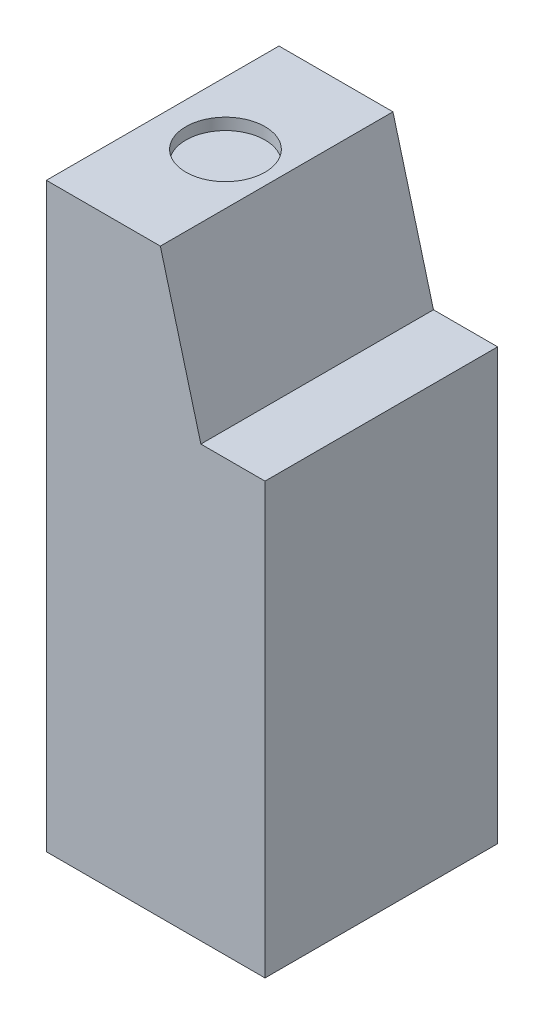
ISO-10303-21;
HEADER;
FILE_DESCRIPTION(('STEP AP214'),'2;1');
FILE_NAME('part.step','',(''),(''),'','','');
FILE_SCHEMA(('AUTOMOTIVE_DESIGN { 1 0 10303 214 1 1 1 1 }'));
ENDSEC;
DATA;
#1=APPLICATION_CONTEXT('core data for automotive mechanical design processes');
#2=APPLICATION_PROTOCOL_DEFINITION('international standard','automotive_design',2000,#1);
#3=PRODUCT_CONTEXT('',#1,'mechanical');
#4=PRODUCT('Part','Part','',(#3));
#5=PRODUCT_RELATED_PRODUCT_CATEGORY('part','',(#4));
#6=PRODUCT_DEFINITION_FORMATION('','',#4);
#7=PRODUCT_DEFINITION_CONTEXT('part definition',#1,'design');
#8=PRODUCT_DEFINITION('design','',#6,#7);
#9=PRODUCT_DEFINITION_SHAPE('','',#8);
#10=(LENGTH_UNIT() NAMED_UNIT(*) SI_UNIT(.MILLI.,.METRE.));
#11=(NAMED_UNIT(*) PLANE_ANGLE_UNIT() SI_UNIT($,.RADIAN.));
#12=(NAMED_UNIT(*) SI_UNIT($,.STERADIAN.) SOLID_ANGLE_UNIT());
#13=UNCERTAINTY_MEASURE_WITH_UNIT(LENGTH_MEASURE(1.E-05),#10,'distance_accuracy_value','');
#14=(GEOMETRIC_REPRESENTATION_CONTEXT(3) GLOBAL_UNCERTAINTY_ASSIGNED_CONTEXT((#13)) GLOBAL_UNIT_ASSIGNED_CONTEXT((#10,
#11,#12)) REPRESENTATION_CONTEXT('',''));
#15=CARTESIAN_POINT('',(0.,0.,0.));
#16=DIRECTION('',(0.,0.,1.));
#17=DIRECTION('',(1.,0.,0.));
#18=AXIS2_PLACEMENT_3D('',#15,#16,#17);
#19=CARTESIAN_POINT('',(0.,18.5,5.));
#20=DIRECTION('',(0.,-1.,0.));
#21=DIRECTION('',(0.,0.,-1.));
#22=AXIS2_PLACEMENT_3D('',#19,#20,#21);
#23=PLANE('',#22);
#24=DIRECTION('',(0.,0.,-1.));
#25=VECTOR('',#24,1.);
#26=CARTESIAN_POINT('',(-2.75833024919772,18.5,5.));
#27=LINE('',#26,#25);
#28=CARTESIAN_POINT('',(-2.75833024919772,18.5,5.));
#29=VERTEX_POINT('',#28);
#30=CARTESIAN_POINT('',(-2.75833024919772,18.5,-5.));
#31=VERTEX_POINT('',#30);
#32=EDGE_CURVE('E52',#29,#31,#27,.T.);
#33=ORIENTED_EDGE('',*,*,#32,.F.);
#34=DIRECTION('',(-1.,0.,0.));
#35=VECTOR('',#34,1.);
#36=CARTESIAN_POINT('',(0.,18.5,5.));
#37=LINE('',#36,#35);
#38=CARTESIAN_POINT('',(0.,18.5,5.));
#39=VERTEX_POINT('',#38);
#40=EDGE_CURVE('E103',#39,#29,#37,.T.);
#41=ORIENTED_EDGE('',*,*,#40,.F.);
#42=DIRECTION('',(0.,0.,-1.));
#43=VECTOR('',#42,1.);
#44=CARTESIAN_POINT('',(0.,18.5,5.));
#45=LINE('',#44,#43);
#46=CARTESIAN_POINT('',(0.,18.5,-5.));
#47=VERTEX_POINT('',#46);
#48=EDGE_CURVE('E44',#39,#47,#45,.T.);
#49=ORIENTED_EDGE('',*,*,#48,.T.);
#50=DIRECTION('',(-1.,0.,0.));
#51=VECTOR('',#50,1.);
#52=CARTESIAN_POINT('',(0.,18.5,-5.));
#53=LINE('',#52,#51);
#54=EDGE_CURVE('E177',#47,#31,#53,.T.);
#55=ORIENTED_EDGE('',*,*,#54,.T.);
#56=EDGE_LOOP('',(#33,#41,#49,#55));
#57=FACE_BOUND('',#56,.T.);
#58=ADVANCED_FACE('F35',(#57),#23,.F.);
#59=CARTESIAN_POINT('',(-9.4,0.,5.));
#60=DIRECTION('',(0.,1.,0.));
#61=DIRECTION('',(0.,0.,1.));
#62=AXIS2_PLACEMENT_3D('',#59,#60,#61);
#63=PLANE('',#62);
#64=DIRECTION('',(1.,0.,0.));
#65=VECTOR('',#64,1.);
#66=CARTESIAN_POINT('',(-9.4,0.,-5.));
#67=LINE('',#66,#65);
#68=CARTESIAN_POINT('',(-9.4,0.,-5.));
#69=VERTEX_POINT('',#68);
#70=CARTESIAN_POINT('',(0.,0.,-5.));
#71=VERTEX_POINT('',#70);
#72=EDGE_CURVE('E131',#69,#71,#67,.T.);
#73=ORIENTED_EDGE('',*,*,#72,.T.);
#74=DIRECTION('',(0.,0.,-1.));
#75=VECTOR('',#74,1.);
#76=CARTESIAN_POINT('',(0.,0.,5.));
#77=LINE('',#76,#75);
#78=CARTESIAN_POINT('',(0.,0.,5.));
#79=VERTEX_POINT('',#78);
#80=EDGE_CURVE('E11',#79,#71,#77,.T.);
#81=ORIENTED_EDGE('',*,*,#80,.F.);
#82=DIRECTION('',(1.,0.,0.));
#83=VECTOR('',#82,1.);
#84=CARTESIAN_POINT('',(-9.4,0.,5.));
#85=LINE('',#84,#83);
#86=CARTESIAN_POINT('',(-9.4,0.,5.));
#87=VERTEX_POINT('',#86);
#88=EDGE_CURVE('E126',#87,#79,#85,.T.);
#89=ORIENTED_EDGE('',*,*,#88,.F.);
#90=DIRECTION('',(0.,0.,-1.));
#91=VECTOR('',#90,1.);
#92=CARTESIAN_POINT('',(-9.4,0.,5.));
#93=LINE('',#92,#91);
#94=EDGE_CURVE('E179',#87,#69,#93,.T.);
#95=ORIENTED_EDGE('',*,*,#94,.T.);
#96=EDGE_LOOP('',(#73,#81,#89,#95));
#97=FACE_BOUND('',#96,.T.);
#98=ADVANCED_FACE('F37',(#97),#63,.F.);
#99=CARTESIAN_POINT('',(0.,0.,5.));
#100=DIRECTION('',(-1.,0.,0.));
#101=DIRECTION('',(0.,-1.,0.));
#102=AXIS2_PLACEMENT_3D('',#99,#100,#101);
#103=PLANE('',#102);
#104=DIRECTION('',(0.,1.,0.));
#105=VECTOR('',#104,1.);
#106=CARTESIAN_POINT('',(0.,0.,-5.));
#107=LINE('',#106,#105);
#108=EDGE_CURVE('E170',#71,#47,#107,.T.);
#109=ORIENTED_EDGE('',*,*,#108,.T.);
#110=ORIENTED_EDGE('',*,*,#48,.F.);
#111=DIRECTION('',(0.,1.,0.));
#112=VECTOR('',#111,1.);
#113=CARTESIAN_POINT('',(0.,0.,5.));
#114=LINE('',#113,#112);
#115=EDGE_CURVE('E84',#79,#39,#114,.T.);
#116=ORIENTED_EDGE('',*,*,#115,.F.);
#117=ORIENTED_EDGE('',*,*,#80,.T.);
#118=EDGE_LOOP('',(#109,#110,#116,#117));
#119=FACE_BOUND('',#118,.T.);
#120=ADVANCED_FACE('F161',(#119),#103,.F.);
#121=CARTESIAN_POINT('',(-9.40000000000001,18.5,5.));
#122=DIRECTION('',(1.,0.,0.));
#123=DIRECTION('',(0.,1.,0.));
#124=AXIS2_PLACEMENT_3D('',#121,#122,#123);
#125=PLANE('',#124);
#126=DIRECTION('',(0.,-1.,0.));
#127=VECTOR('',#126,1.);
#128=CARTESIAN_POINT('',(-9.40000000000001,18.5,-5.));
#129=LINE('',#128,#127);
#130=CARTESIAN_POINT('',(-9.40000000000001,25.,-5.));
#131=VERTEX_POINT('',#130);
#132=EDGE_CURVE('E79',#131,#69,#129,.T.);
#133=ORIENTED_EDGE('',*,*,#132,.T.);
#134=ORIENTED_EDGE('',*,*,#94,.F.);
#135=DIRECTION('',(0.,-1.,0.));
#136=VECTOR('',#135,1.);
#137=CARTESIAN_POINT('',(-9.40000000000001,18.5,5.));
#138=LINE('',#137,#136);
#139=CARTESIAN_POINT('',(-9.40000000000001,25.,5.));
#140=VERTEX_POINT('',#139);
#141=EDGE_CURVE('E61',#140,#87,#138,.T.);
#142=ORIENTED_EDGE('',*,*,#141,.F.);
#143=DIRECTION('',(0.,0.,-1.));
#144=VECTOR('',#143,1.);
#145=CARTESIAN_POINT('',(-9.40000000000001,25.,5.));
#146=LINE('',#145,#144);
#147=EDGE_CURVE('E114',#140,#131,#146,.T.);
#148=ORIENTED_EDGE('',*,*,#147,.T.);
#149=EDGE_LOOP('',(#133,#134,#142,#148));
#150=FACE_BOUND('',#149,.T.);
#151=ADVANCED_FACE('F164',(#150),#125,.F.);
#152=CARTESIAN_POINT('',(-9.4,0.,5.));
#153=DIRECTION('',(0.,0.,-1.));
#154=DIRECTION('',(-1.,0.,0.));
#155=AXIS2_PLACEMENT_3D('',#152,#153,#154);
#156=PLANE('',#155);
#157=ORIENTED_EDGE('',*,*,#88,.T.);
#158=ORIENTED_EDGE('',*,*,#115,.T.);
#159=ORIENTED_EDGE('',*,*,#40,.T.);
#160=DIRECTION('',(-0.258819045102518,0.965925826289069,0.));
#161=VECTOR('',#160,1.);
#162=CARTESIAN_POINT('',(-4.5,25.,5.));
#163=LINE('',#162,#161);
#164=CARTESIAN_POINT('',(-4.5,25.,5.));
#165=VERTEX_POINT('',#164);
#166=EDGE_CURVE('E97',#29,#165,#163,.T.);
#167=ORIENTED_EDGE('',*,*,#166,.T.);
#168=DIRECTION('',(-1.,0.,0.));
#169=VECTOR('',#168,1.);
#170=CARTESIAN_POINT('',(-9.40000000000001,25.,5.));
#171=LINE('',#170,#169);
#172=EDGE_CURVE('E101',#165,#140,#171,.T.);
#173=ORIENTED_EDGE('',*,*,#172,.T.);
#174=ORIENTED_EDGE('',*,*,#141,.T.);
#175=EDGE_LOOP('',(#157,#158,#159,#167,#173,#174));
#176=FACE_BOUND('',#175,.T.);
#177=ADVANCED_FACE('F99',(#176),#156,.F.);
#178=CARTESIAN_POINT('',(-9.4,0.,-5.));
#179=DIRECTION('',(0.,0.,-1.));
#180=DIRECTION('',(-1.,0.,0.));
#181=AXIS2_PLACEMENT_3D('',#178,#179,#180);
#182=PLANE('',#181);
#183=ORIENTED_EDGE('',*,*,#72,.F.);
#184=ORIENTED_EDGE('',*,*,#132,.F.);
#185=DIRECTION('',(-1.,0.,0.));
#186=VECTOR('',#185,1.);
#187=CARTESIAN_POINT('',(-9.40000000000001,25.,-5.));
#188=LINE('',#187,#186);
#189=CARTESIAN_POINT('',(-4.5,25.,-5.));
#190=VERTEX_POINT('',#189);
#191=EDGE_CURVE('E105',#190,#131,#188,.T.);
#192=ORIENTED_EDGE('',*,*,#191,.F.);
#193=DIRECTION('',(-0.258819045102518,0.965925826289069,0.));
#194=VECTOR('',#193,1.);
#195=CARTESIAN_POINT('',(-4.5,25.,-5.));
#196=LINE('',#195,#194);
#197=EDGE_CURVE('E110',#31,#190,#196,.T.);
#198=ORIENTED_EDGE('',*,*,#197,.F.);
#199=ORIENTED_EDGE('',*,*,#54,.F.);
#200=ORIENTED_EDGE('',*,*,#108,.F.);
#201=EDGE_LOOP('',(#183,#184,#192,#198,#199,#200));
#202=FACE_BOUND('',#201,.T.);
#203=ADVANCED_FACE('F154',(#202),#182,.T.);
#204=CARTESIAN_POINT('',(-4.5,25.,5.));
#205=DIRECTION('',(-0.965925826289069,-0.258819045102518,0.));
#206=DIRECTION('',(0.258819045102518,-0.965925826289069,0.));
#207=AXIS2_PLACEMENT_3D('',#204,#205,#206);
#208=PLANE('',#207);
#209=ORIENTED_EDGE('',*,*,#197,.T.);
#210=DIRECTION('',(0.,0.,-1.));
#211=VECTOR('',#210,1.);
#212=CARTESIAN_POINT('',(-4.5,25.,5.));
#213=LINE('',#212,#211);
#214=EDGE_CURVE('E107',#165,#190,#213,.T.);
#215=ORIENTED_EDGE('',*,*,#214,.F.);
#216=ORIENTED_EDGE('',*,*,#166,.F.);
#217=ORIENTED_EDGE('',*,*,#32,.T.);
#218=EDGE_LOOP('',(#209,#215,#216,#217));
#219=FACE_BOUND('',#218,.T.);
#220=ADVANCED_FACE('F108',(#219),#208,.F.);
#221=CARTESIAN_POINT('',(-9.40000000000001,25.,5.));
#222=DIRECTION('',(0.,-1.,0.));
#223=DIRECTION('',(0.,0.,-1.));
#224=AXIS2_PLACEMENT_3D('',#221,#222,#223);
#225=PLANE('',#224);
#226=CARTESIAN_POINT('',(-6.70000000000001,25.,0.));
#227=DIRECTION('',(0.,1.,0.));
#228=DIRECTION('',(0.,0.,1.));
#229=AXIS2_PLACEMENT_3D('',#226,#227,#228);
#230=CIRCLE('',#229,1.7);
#231=CARTESIAN_POINT('',(-6.70000000000001,25.,1.7));
#232=VERTEX_POINT('',#231);
#233=EDGE_CURVE('E121',#232,#232,#230,.T.);
#234=ORIENTED_EDGE('',*,*,#233,.F.);
#235=EDGE_LOOP('',(#234));
#236=FACE_BOUND('',#235,.T.);
#237=ORIENTED_EDGE('',*,*,#191,.T.);
#238=ORIENTED_EDGE('',*,*,#147,.F.);
#239=ORIENTED_EDGE('',*,*,#172,.F.);
#240=ORIENTED_EDGE('',*,*,#214,.T.);
#241=EDGE_LOOP('',(#237,#238,#239,#240));
#242=FACE_BOUND('',#241,.T.);
#243=ADVANCED_FACE('F116',(#236,#242),#225,.F.);
#244=CARTESIAN_POINT('',(-6.70000000000001,24.5,0.));
#245=DIRECTION('',(0.,1.,0.));
#246=DIRECTION('',(0.,0.,1.));
#247=AXIS2_PLACEMENT_3D('',#244,#245,#246);
#248=CYLINDRICAL_SURFACE('',#247,1.7);
#249=CARTESIAN_POINT('',(-6.70000000000001,24.5,0.));
#250=DIRECTION('',(0.,1.,0.));
#251=DIRECTION('',(0.,0.,1.));
#252=AXIS2_PLACEMENT_3D('',#249,#250,#251);
#253=CIRCLE('',#252,1.7);
#254=CARTESIAN_POINT('',(-6.70000000000001,24.5,1.7));
#255=VERTEX_POINT('',#254);
#256=EDGE_CURVE('E135',#255,#255,#253,.T.);
#257=ORIENTED_EDGE('',*,*,#256,.F.);
#258=EDGE_LOOP('',(#257));
#259=FACE_BOUND('',#258,.T.);
#260=ORIENTED_EDGE('',*,*,#233,.T.);
#261=EDGE_LOOP('',(#260));
#262=FACE_BOUND('',#261,.T.);
#263=ADVANCED_FACE('F143',(#259,#262),#248,.F.);
#264=CARTESIAN_POINT('',(-6.70000000000001,24.5,0.));
#265=DIRECTION('',(0.,1.,0.));
#266=DIRECTION('',(0.,0.,1.));
#267=AXIS2_PLACEMENT_3D('',#264,#265,#266);
#268=PLANE('',#267);
#269=ORIENTED_EDGE('',*,*,#256,.T.);
#270=EDGE_LOOP('',(#269));
#271=FACE_BOUND('',#270,.T.);
#272=ADVANCED_FACE('F151',(#271),#268,.T.);
#273=CLOSED_SHELL('',(#58,#98,#120,#151,#177,#203,#220,#243,#263,#272));
#274=MANIFOLD_SOLID_BREP('B2',#273);
#275=ADVANCED_BREP_SHAPE_REPRESENTATION('',(#18,#274),#14);
#276=SHAPE_DEFINITION_REPRESENTATION(#9,#275);
ENDSEC;
END-ISO-10303-21;
